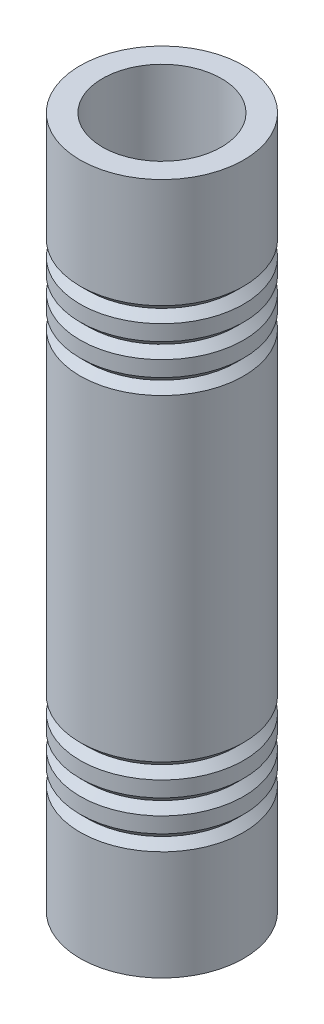
ISO-10303-21;
HEADER;
FILE_DESCRIPTION(('STEP AP214'),'2;1');
FILE_NAME('part.step','',(''),(''),'','','');
FILE_SCHEMA(('AUTOMOTIVE_DESIGN { 1 0 10303 214 1 1 1 1 }'));
ENDSEC;
DATA;
#1=APPLICATION_CONTEXT('core data for automotive mechanical design processes');
#2=APPLICATION_PROTOCOL_DEFINITION('international standard','automotive_design',2000,#1);
#3=PRODUCT_CONTEXT('',#1,'mechanical');
#4=PRODUCT('Part','Part','',(#3));
#5=PRODUCT_RELATED_PRODUCT_CATEGORY('part','',(#4));
#6=PRODUCT_DEFINITION_FORMATION('','',#4);
#7=PRODUCT_DEFINITION_CONTEXT('part definition',#1,'design');
#8=PRODUCT_DEFINITION('design','',#6,#7);
#9=PRODUCT_DEFINITION_SHAPE('','',#8);
#10=(LENGTH_UNIT() NAMED_UNIT(*) SI_UNIT(.MILLI.,.METRE.));
#11=(NAMED_UNIT(*) PLANE_ANGLE_UNIT() SI_UNIT($,.RADIAN.));
#12=(NAMED_UNIT(*) SI_UNIT($,.STERADIAN.) SOLID_ANGLE_UNIT());
#13=UNCERTAINTY_MEASURE_WITH_UNIT(LENGTH_MEASURE(1.E-05),#10,'distance_accuracy_value','');
#14=(GEOMETRIC_REPRESENTATION_CONTEXT(3) GLOBAL_UNCERTAINTY_ASSIGNED_CONTEXT((#13)) GLOBAL_UNIT_ASSIGNED_CONTEXT((#10,
#11,#12)) REPRESENTATION_CONTEXT('',''));
#15=CARTESIAN_POINT('',(0.,0.,0.));
#16=DIRECTION('',(0.,0.,1.));
#17=DIRECTION('',(1.,0.,0.));
#18=AXIS2_PLACEMENT_3D('',#15,#16,#17);
#19=CARTESIAN_POINT('',(0.,0.,0.));
#20=DIRECTION('',(0.,1.,0.));
#21=DIRECTION('',(0.,0.,1.));
#22=AXIS2_PLACEMENT_3D('',#19,#20,#21);
#23=CYLINDRICAL_SURFACE('',#22,15.2908000000005);
#24=CARTESIAN_POINT('',(0.,177.8,0.));
#25=DIRECTION('',(0.,1.,0.));
#26=DIRECTION('',(0.,0.,1.));
#27=AXIS2_PLACEMENT_3D('',#24,#25,#26);
#28=CIRCLE('',#27,15.2908000000011);
#29=CARTESIAN_POINT('',(0.,177.8,15.2908000000011));
#30=VERTEX_POINT('',#29);
#31=EDGE_CURVE('E10',#30,#30,#28,.T.);
#32=ORIENTED_EDGE('',*,*,#31,.T.);
#33=EDGE_LOOP('',(#32));
#34=FACE_BOUND('',#33,.T.);
#35=CARTESIAN_POINT('',(0.,0.,0.));
#36=DIRECTION('',(0.,1.,0.));
#37=DIRECTION('',(0.,0.,1.));
#38=AXIS2_PLACEMENT_3D('',#35,#36,#37);
#39=CIRCLE('',#38,15.2907999999998);
#40=CARTESIAN_POINT('',(0.,0.,15.2907999999998));
#41=VERTEX_POINT('',#40);
#42=EDGE_CURVE('E105',#41,#41,#39,.T.);
#43=ORIENTED_EDGE('',*,*,#42,.F.);
#44=EDGE_LOOP('',(#43));
#45=FACE_BOUND('',#44,.T.);
#46=ADVANCED_FACE('F35',(#34,#45),#23,.F.);
#47=CARTESIAN_POINT('',(15.2908000000011,177.8,0.));
#48=DIRECTION('',(0.,1.,0.));
#49=DIRECTION('',(0.,0.,1.));
#50=AXIS2_PLACEMENT_3D('',#47,#48,#49);
#51=PLANE('',#50);
#52=CARTESIAN_POINT('',(0.,177.8,0.));
#53=DIRECTION('',(0.,1.,0.));
#54=DIRECTION('',(0.,0.,1.));
#55=AXIS2_PLACEMENT_3D('',#52,#53,#54);
#56=CIRCLE('',#55,21.0343750000013);
#57=CARTESIAN_POINT('',(0.,177.8,21.0343750000013));
#58=VERTEX_POINT('',#57);
#59=EDGE_CURVE('E41',#58,#58,#56,.T.);
#60=ORIENTED_EDGE('',*,*,#59,.T.);
#61=EDGE_LOOP('',(#60));
#62=FACE_BOUND('',#61,.T.);
#63=ORIENTED_EDGE('',*,*,#31,.F.);
#64=EDGE_LOOP('',(#63));
#65=FACE_BOUND('',#64,.T.);
#66=ADVANCED_FACE('F113',(#62,#65),#51,.T.);
#67=CARTESIAN_POINT('',(0.,0.,0.));
#68=DIRECTION('',(0.,1.,0.));
#69=DIRECTION('',(0.,0.,1.));
#70=AXIS2_PLACEMENT_3D('',#67,#68,#69);
#71=CYLINDRICAL_SURFACE('',#70,21.0343750000006);
#72=CARTESIAN_POINT('',(0.,149.7,0.));
#73=DIRECTION('',(0.,1.,0.));
#74=DIRECTION('',(0.,0.,1.));
#75=AXIS2_PLACEMENT_3D('',#72,#73,#74);
#76=CIRCLE('',#75,21.034375);
#77=CARTESIAN_POINT('',(0.,149.7,21.034375));
#78=VERTEX_POINT('',#77);
#79=EDGE_CURVE('E45',#78,#78,#76,.T.);
#80=ORIENTED_EDGE('',*,*,#79,.T.);
#81=EDGE_LOOP('',(#80));
#82=FACE_BOUND('',#81,.T.);
#83=ORIENTED_EDGE('',*,*,#59,.F.);
#84=EDGE_LOOP('',(#83));
#85=FACE_BOUND('',#84,.T.);
#86=ADVANCED_FACE('F117',(#82,#85),#71,.T.);
#87=CARTESIAN_POINT('',(0.,149.7,0.));
#88=DIRECTION('',(0.,1.,0.));
#89=DIRECTION('',(0.,0.,1.));
#90=AXIS2_PLACEMENT_3D('',#87,#88,#89);
#91=CONICAL_SURFACE('',#90,21.034375,0.785398163397146);
#92=CARTESIAN_POINT('',(0.,147.7,0.));
#93=DIRECTION('',(0.,1.,0.));
#94=DIRECTION('',(0.,0.,1.));
#95=AXIS2_PLACEMENT_3D('',#92,#93,#94);
#96=CIRCLE('',#95,19.0343750000012);
#97=CARTESIAN_POINT('',(0.,147.7,19.0343750000012));
#98=VERTEX_POINT('',#97);
#99=EDGE_CURVE('E49',#98,#98,#96,.T.);
#100=ORIENTED_EDGE('',*,*,#99,.T.);
#101=EDGE_LOOP('',(#100));
#102=FACE_BOUND('',#101,.T.);
#103=ORIENTED_EDGE('',*,*,#79,.F.);
#104=EDGE_LOOP('',(#103));
#105=FACE_BOUND('',#104,.T.);
#106=ADVANCED_FACE('F121',(#102,#105),#91,.T.);
#107=CARTESIAN_POINT('',(0.,147.7,0.));
#108=DIRECTION('',(0.,-1.,0.));
#109=DIRECTION('',(0.,0.,-1.));
#110=AXIS2_PLACEMENT_3D('',#107,#108,#109);
#111=CONICAL_SURFACE('',#110,19.0343750000012,0.785398163397146);
#112=CARTESIAN_POINT('',(0.,145.7,0.));
#113=DIRECTION('',(0.,1.,0.));
#114=DIRECTION('',(0.,0.,1.));
#115=AXIS2_PLACEMENT_3D('',#112,#113,#114);
#116=CIRCLE('',#115,21.034375);
#117=CARTESIAN_POINT('',(0.,145.7,21.034375));
#118=VERTEX_POINT('',#117);
#119=EDGE_CURVE('E54',#118,#118,#116,.T.);
#120=ORIENTED_EDGE('',*,*,#119,.T.);
#121=EDGE_LOOP('',(#120));
#122=FACE_BOUND('',#121,.T.);
#123=ORIENTED_EDGE('',*,*,#99,.F.);
#124=EDGE_LOOP('',(#123));
#125=FACE_BOUND('',#124,.T.);
#126=ADVANCED_FACE('F128',(#122,#125),#111,.T.);
#127=CARTESIAN_POINT('',(0.,0.,0.));
#128=DIRECTION('',(0.,1.,0.));
#129=DIRECTION('',(0.,0.,1.));
#130=AXIS2_PLACEMENT_3D('',#127,#128,#129);
#131=CYLINDRICAL_SURFACE('',#130,21.034375);
#132=CARTESIAN_POINT('',(0.,141.7,0.));
#133=DIRECTION('',(0.,1.,0.));
#134=DIRECTION('',(0.,0.,1.));
#135=AXIS2_PLACEMENT_3D('',#132,#133,#134);
#136=CIRCLE('',#135,21.034375);
#137=CARTESIAN_POINT('',(0.,141.7,21.034375));
#138=VERTEX_POINT('',#137);
#139=EDGE_CURVE('E57',#138,#138,#136,.T.);
#140=ORIENTED_EDGE('',*,*,#139,.T.);
#141=EDGE_LOOP('',(#140));
#142=FACE_BOUND('',#141,.T.);
#143=ORIENTED_EDGE('',*,*,#119,.F.);
#144=EDGE_LOOP('',(#143));
#145=FACE_BOUND('',#144,.T.);
#146=ADVANCED_FACE('F132',(#142,#145),#131,.T.);
#147=CARTESIAN_POINT('',(0.,141.7,0.));
#148=DIRECTION('',(0.,1.,0.));
#149=DIRECTION('',(0.,0.,1.));
#150=AXIS2_PLACEMENT_3D('',#147,#148,#149);
#151=CONICAL_SURFACE('',#150,21.034375,0.785398163397455);
#152=CARTESIAN_POINT('',(0.,139.7,0.));
#153=DIRECTION('',(0.,1.,0.));
#154=DIRECTION('',(0.,0.,1.));
#155=AXIS2_PLACEMENT_3D('',#152,#153,#154);
#156=CIRCLE('',#155,19.034375);
#157=CARTESIAN_POINT('',(0.,139.7,19.034375));
#158=VERTEX_POINT('',#157);
#159=EDGE_CURVE('E60',#158,#158,#156,.T.);
#160=ORIENTED_EDGE('',*,*,#159,.T.);
#161=EDGE_LOOP('',(#160));
#162=FACE_BOUND('',#161,.T.);
#163=ORIENTED_EDGE('',*,*,#139,.F.);
#164=EDGE_LOOP('',(#163));
#165=FACE_BOUND('',#164,.T.);
#166=ADVANCED_FACE('F136',(#162,#165),#151,.T.);
#167=CARTESIAN_POINT('',(0.,139.7,0.));
#168=DIRECTION('',(0.,-1.,0.));
#169=DIRECTION('',(0.,0.,-1.));
#170=AXIS2_PLACEMENT_3D('',#167,#168,#169);
#171=CONICAL_SURFACE('',#170,19.034375,0.785398163397455);
#172=CARTESIAN_POINT('',(0.,137.7,0.));
#173=DIRECTION('',(0.,1.,0.));
#174=DIRECTION('',(0.,0.,1.));
#175=AXIS2_PLACEMENT_3D('',#172,#173,#174);
#176=CIRCLE('',#175,21.034375);
#177=CARTESIAN_POINT('',(0.,137.7,21.034375));
#178=VERTEX_POINT('',#177);
#179=EDGE_CURVE('E63',#178,#178,#176,.T.);
#180=ORIENTED_EDGE('',*,*,#179,.T.);
#181=EDGE_LOOP('',(#180));
#182=FACE_BOUND('',#181,.T.);
#183=ORIENTED_EDGE('',*,*,#159,.F.);
#184=EDGE_LOOP('',(#183));
#185=FACE_BOUND('',#184,.T.);
#186=ADVANCED_FACE('F140',(#182,#185),#171,.T.);
#187=CARTESIAN_POINT('',(0.,0.,0.));
#188=DIRECTION('',(0.,1.,0.));
#189=DIRECTION('',(0.,0.,1.));
#190=AXIS2_PLACEMENT_3D('',#187,#188,#189);
#191=CYLINDRICAL_SURFACE('',#190,21.034375);
#192=CARTESIAN_POINT('',(0.,133.7,0.));
#193=DIRECTION('',(0.,1.,0.));
#194=DIRECTION('',(0.,0.,1.));
#195=AXIS2_PLACEMENT_3D('',#192,#193,#194);
#196=CIRCLE('',#195,21.034375);
#197=CARTESIAN_POINT('',(0.,133.7,21.034375));
#198=VERTEX_POINT('',#197);
#199=EDGE_CURVE('E66',#198,#198,#196,.T.);
#200=ORIENTED_EDGE('',*,*,#199,.T.);
#201=EDGE_LOOP('',(#200));
#202=FACE_BOUND('',#201,.T.);
#203=ORIENTED_EDGE('',*,*,#179,.F.);
#204=EDGE_LOOP('',(#203));
#205=FACE_BOUND('',#204,.T.);
#206=ADVANCED_FACE('F144',(#202,#205),#191,.T.);
#207=CARTESIAN_POINT('',(0.,133.7,0.));
#208=DIRECTION('',(0.,1.,0.));
#209=DIRECTION('',(0.,0.,1.));
#210=AXIS2_PLACEMENT_3D('',#207,#208,#209);
#211=CONICAL_SURFACE('',#210,21.034375,0.785398163397447);
#212=CARTESIAN_POINT('',(0.,131.7,0.));
#213=DIRECTION('',(0.,1.,0.));
#214=DIRECTION('',(0.,0.,1.));
#215=AXIS2_PLACEMENT_3D('',#212,#213,#214);
#216=CIRCLE('',#215,19.034375);
#217=CARTESIAN_POINT('',(0.,131.7,19.034375));
#218=VERTEX_POINT('',#217);
#219=EDGE_CURVE('E69',#218,#218,#216,.T.);
#220=ORIENTED_EDGE('',*,*,#219,.T.);
#221=EDGE_LOOP('',(#220));
#222=FACE_BOUND('',#221,.T.);
#223=ORIENTED_EDGE('',*,*,#199,.F.);
#224=EDGE_LOOP('',(#223));
#225=FACE_BOUND('',#224,.T.);
#226=ADVANCED_FACE('F148',(#222,#225),#211,.T.);
#227=CARTESIAN_POINT('',(0.,131.7,0.));
#228=DIRECTION('',(0.,-1.,0.));
#229=DIRECTION('',(0.,0.,-1.));
#230=AXIS2_PLACEMENT_3D('',#227,#228,#229);
#231=CONICAL_SURFACE('',#230,19.034375,0.78539816339746);
#232=CARTESIAN_POINT('',(0.,129.7,0.));
#233=DIRECTION('',(0.,1.,0.));
#234=DIRECTION('',(0.,0.,1.));
#235=AXIS2_PLACEMENT_3D('',#232,#233,#234);
#236=CIRCLE('',#235,21.034375);
#237=CARTESIAN_POINT('',(0.,129.7,21.034375));
#238=VERTEX_POINT('',#237);
#239=EDGE_CURVE('E72',#238,#238,#236,.T.);
#240=ORIENTED_EDGE('',*,*,#239,.T.);
#241=EDGE_LOOP('',(#240));
#242=FACE_BOUND('',#241,.T.);
#243=ORIENTED_EDGE('',*,*,#219,.F.);
#244=EDGE_LOOP('',(#243));
#245=FACE_BOUND('',#244,.T.);
#246=ADVANCED_FACE('F152',(#242,#245),#231,.T.);
#247=CARTESIAN_POINT('',(0.,0.,0.));
#248=DIRECTION('',(0.,1.,0.));
#249=DIRECTION('',(0.,0.,1.));
#250=AXIS2_PLACEMENT_3D('',#247,#248,#249);
#251=CYLINDRICAL_SURFACE('',#250,21.034375);
#252=CARTESIAN_POINT('',(0.,48.1,0.));
#253=DIRECTION('',(0.,1.,0.));
#254=DIRECTION('',(0.,0.,1.));
#255=AXIS2_PLACEMENT_3D('',#252,#253,#254);
#256=CIRCLE('',#255,21.034375);
#257=CARTESIAN_POINT('',(0.,48.1,21.034375));
#258=VERTEX_POINT('',#257);
#259=EDGE_CURVE('E75',#258,#258,#256,.T.);
#260=ORIENTED_EDGE('',*,*,#259,.T.);
#261=EDGE_LOOP('',(#260));
#262=FACE_BOUND('',#261,.T.);
#263=ORIENTED_EDGE('',*,*,#239,.F.);
#264=EDGE_LOOP('',(#263));
#265=FACE_BOUND('',#264,.T.);
#266=ADVANCED_FACE('F156',(#262,#265),#251,.T.);
#267=CARTESIAN_POINT('',(0.,48.1,0.));
#268=DIRECTION('',(0.,1.,0.));
#269=DIRECTION('',(0.,0.,1.));
#270=AXIS2_PLACEMENT_3D('',#267,#268,#269);
#271=CONICAL_SURFACE('',#270,21.034375,0.785398163397455);
#272=CARTESIAN_POINT('',(0.,46.1,0.));
#273=DIRECTION('',(0.,1.,0.));
#274=DIRECTION('',(0.,0.,1.));
#275=AXIS2_PLACEMENT_3D('',#272,#273,#274);
#276=CIRCLE('',#275,19.034375);
#277=CARTESIAN_POINT('',(0.,46.1,19.034375));
#278=VERTEX_POINT('',#277);
#279=EDGE_CURVE('E78',#278,#278,#276,.T.);
#280=ORIENTED_EDGE('',*,*,#279,.T.);
#281=EDGE_LOOP('',(#280));
#282=FACE_BOUND('',#281,.T.);
#283=ORIENTED_EDGE('',*,*,#259,.F.);
#284=EDGE_LOOP('',(#283));
#285=FACE_BOUND('',#284,.T.);
#286=ADVANCED_FACE('F160',(#282,#285),#271,.T.);
#287=CARTESIAN_POINT('',(0.,46.1,0.));
#288=DIRECTION('',(0.,-1.,0.));
#289=DIRECTION('',(0.,0.,-1.));
#290=AXIS2_PLACEMENT_3D('',#287,#288,#289);
#291=CONICAL_SURFACE('',#290,19.034375,0.785398163397453);
#292=CARTESIAN_POINT('',(0.,44.1000000000001,0.));
#293=DIRECTION('',(0.,1.,0.));
#294=DIRECTION('',(0.,0.,1.));
#295=AXIS2_PLACEMENT_3D('',#292,#293,#294);
#296=CIRCLE('',#295,21.034375);
#297=CARTESIAN_POINT('',(0.,44.1000000000001,21.034375));
#298=VERTEX_POINT('',#297);
#299=EDGE_CURVE('E81',#298,#298,#296,.T.);
#300=ORIENTED_EDGE('',*,*,#299,.T.);
#301=EDGE_LOOP('',(#300));
#302=FACE_BOUND('',#301,.T.);
#303=ORIENTED_EDGE('',*,*,#279,.F.);
#304=EDGE_LOOP('',(#303));
#305=FACE_BOUND('',#304,.T.);
#306=ADVANCED_FACE('F164',(#302,#305),#291,.T.);
#307=CARTESIAN_POINT('',(0.,0.,0.));
#308=DIRECTION('',(0.,1.,0.));
#309=DIRECTION('',(0.,0.,1.));
#310=AXIS2_PLACEMENT_3D('',#307,#308,#309);
#311=CYLINDRICAL_SURFACE('',#310,21.034375);
#312=CARTESIAN_POINT('',(0.,40.1,0.));
#313=DIRECTION('',(0.,1.,0.));
#314=DIRECTION('',(0.,0.,1.));
#315=AXIS2_PLACEMENT_3D('',#312,#313,#314);
#316=CIRCLE('',#315,21.034375);
#317=CARTESIAN_POINT('',(0.,40.1,21.034375));
#318=VERTEX_POINT('',#317);
#319=EDGE_CURVE('E84',#318,#318,#316,.T.);
#320=ORIENTED_EDGE('',*,*,#319,.T.);
#321=EDGE_LOOP('',(#320));
#322=FACE_BOUND('',#321,.T.);
#323=ORIENTED_EDGE('',*,*,#299,.F.);
#324=EDGE_LOOP('',(#323));
#325=FACE_BOUND('',#324,.T.);
#326=ADVANCED_FACE('F168',(#322,#325),#311,.T.);
#327=CARTESIAN_POINT('',(0.,40.1,0.));
#328=DIRECTION('',(0.,1.,0.));
#329=DIRECTION('',(0.,0.,1.));
#330=AXIS2_PLACEMENT_3D('',#327,#328,#329);
#331=CONICAL_SURFACE('',#330,21.034375,0.785398163397455);
#332=CARTESIAN_POINT('',(0.,38.1,0.));
#333=DIRECTION('',(0.,1.,0.));
#334=DIRECTION('',(0.,0.,1.));
#335=AXIS2_PLACEMENT_3D('',#332,#333,#334);
#336=CIRCLE('',#335,19.034375);
#337=CARTESIAN_POINT('',(0.,38.1,19.034375));
#338=VERTEX_POINT('',#337);
#339=EDGE_CURVE('E87',#338,#338,#336,.T.);
#340=ORIENTED_EDGE('',*,*,#339,.T.);
#341=EDGE_LOOP('',(#340));
#342=FACE_BOUND('',#341,.T.);
#343=ORIENTED_EDGE('',*,*,#319,.F.);
#344=EDGE_LOOP('',(#343));
#345=FACE_BOUND('',#344,.T.);
#346=ADVANCED_FACE('F172',(#342,#345),#331,.T.);
#347=CARTESIAN_POINT('',(0.,38.1,0.));
#348=DIRECTION('',(0.,-1.,0.));
#349=DIRECTION('',(0.,0.,-1.));
#350=AXIS2_PLACEMENT_3D('',#347,#348,#349);
#351=CONICAL_SURFACE('',#350,19.034375,0.785398163397455);
#352=CARTESIAN_POINT('',(0.,36.1000000000001,0.));
#353=DIRECTION('',(0.,1.,0.));
#354=DIRECTION('',(0.,0.,1.));
#355=AXIS2_PLACEMENT_3D('',#352,#353,#354);
#356=CIRCLE('',#355,21.034375);
#357=CARTESIAN_POINT('',(0.,36.1000000000001,21.034375));
#358=VERTEX_POINT('',#357);
#359=EDGE_CURVE('E90',#358,#358,#356,.T.);
#360=ORIENTED_EDGE('',*,*,#359,.T.);
#361=EDGE_LOOP('',(#360));
#362=FACE_BOUND('',#361,.T.);
#363=ORIENTED_EDGE('',*,*,#339,.F.);
#364=EDGE_LOOP('',(#363));
#365=FACE_BOUND('',#364,.T.);
#366=ADVANCED_FACE('F176',(#362,#365),#351,.T.);
#367=CARTESIAN_POINT('',(0.,0.,0.));
#368=DIRECTION('',(0.,1.,0.));
#369=DIRECTION('',(0.,0.,1.));
#370=AXIS2_PLACEMENT_3D('',#367,#368,#369);
#371=CYLINDRICAL_SURFACE('',#370,21.034375);
#372=CARTESIAN_POINT('',(0.,32.1,0.));
#373=DIRECTION('',(0.,1.,0.));
#374=DIRECTION('',(0.,0.,1.));
#375=AXIS2_PLACEMENT_3D('',#372,#373,#374);
#376=CIRCLE('',#375,21.034375);
#377=CARTESIAN_POINT('',(0.,32.1,21.034375));
#378=VERTEX_POINT('',#377);
#379=EDGE_CURVE('E93',#378,#378,#376,.T.);
#380=ORIENTED_EDGE('',*,*,#379,.T.);
#381=EDGE_LOOP('',(#380));
#382=FACE_BOUND('',#381,.T.);
#383=ORIENTED_EDGE('',*,*,#359,.F.);
#384=EDGE_LOOP('',(#383));
#385=FACE_BOUND('',#384,.T.);
#386=ADVANCED_FACE('F180',(#382,#385),#371,.T.);
#387=CARTESIAN_POINT('',(0.,32.1,0.));
#388=DIRECTION('',(0.,1.,0.));
#389=DIRECTION('',(0.,0.,1.));
#390=AXIS2_PLACEMENT_3D('',#387,#388,#389);
#391=CONICAL_SURFACE('',#390,21.034375,0.785398163397455);
#392=CARTESIAN_POINT('',(0.,30.1,0.));
#393=DIRECTION('',(0.,1.,0.));
#394=DIRECTION('',(0.,0.,1.));
#395=AXIS2_PLACEMENT_3D('',#392,#393,#394);
#396=CIRCLE('',#395,19.034375);
#397=CARTESIAN_POINT('',(0.,30.1,19.034375));
#398=VERTEX_POINT('',#397);
#399=EDGE_CURVE('E96',#398,#398,#396,.T.);
#400=ORIENTED_EDGE('',*,*,#399,.T.);
#401=EDGE_LOOP('',(#400));
#402=FACE_BOUND('',#401,.T.);
#403=ORIENTED_EDGE('',*,*,#379,.F.);
#404=EDGE_LOOP('',(#403));
#405=FACE_BOUND('',#404,.T.);
#406=ADVANCED_FACE('F184',(#402,#405),#391,.T.);
#407=CARTESIAN_POINT('',(0.,30.1,0.));
#408=DIRECTION('',(0.,-1.,0.));
#409=DIRECTION('',(0.,0.,-1.));
#410=AXIS2_PLACEMENT_3D('',#407,#408,#409);
#411=CONICAL_SURFACE('',#410,19.034375,0.785398163397453);
#412=CARTESIAN_POINT('',(0.,28.1,0.));
#413=DIRECTION('',(0.,1.,0.));
#414=DIRECTION('',(0.,0.,1.));
#415=AXIS2_PLACEMENT_3D('',#412,#413,#414);
#416=CIRCLE('',#415,21.034375);
#417=CARTESIAN_POINT('',(0.,28.1,21.034375));
#418=VERTEX_POINT('',#417);
#419=EDGE_CURVE('E99',#418,#418,#416,.T.);
#420=ORIENTED_EDGE('',*,*,#419,.T.);
#421=EDGE_LOOP('',(#420));
#422=FACE_BOUND('',#421,.T.);
#423=ORIENTED_EDGE('',*,*,#399,.F.);
#424=EDGE_LOOP('',(#423));
#425=FACE_BOUND('',#424,.T.);
#426=ADVANCED_FACE('F188',(#422,#425),#411,.T.);
#427=CARTESIAN_POINT('',(0.,0.,0.));
#428=DIRECTION('',(0.,1.,0.));
#429=DIRECTION('',(0.,0.,1.));
#430=AXIS2_PLACEMENT_3D('',#427,#428,#429);
#431=CYLINDRICAL_SURFACE('',#430,21.0343750000006);
#432=CARTESIAN_POINT('',(0.,0.,0.));
#433=DIRECTION('',(0.,1.,0.));
#434=DIRECTION('',(0.,0.,1.));
#435=AXIS2_PLACEMENT_3D('',#432,#433,#434);
#436=CIRCLE('',#435,21.0343750000013);
#437=CARTESIAN_POINT('',(0.,0.,21.0343750000013));
#438=VERTEX_POINT('',#437);
#439=EDGE_CURVE('E102',#438,#438,#436,.T.);
#440=ORIENTED_EDGE('',*,*,#439,.T.);
#441=EDGE_LOOP('',(#440));
#442=FACE_BOUND('',#441,.T.);
#443=ORIENTED_EDGE('',*,*,#419,.F.);
#444=EDGE_LOOP('',(#443));
#445=FACE_BOUND('',#444,.T.);
#446=ADVANCED_FACE('F192',(#442,#445),#431,.T.);
#447=CARTESIAN_POINT('',(21.0343750000013,0.,0.));
#448=DIRECTION('',(0.,-1.,0.));
#449=DIRECTION('',(0.,0.,-1.));
#450=AXIS2_PLACEMENT_3D('',#447,#448,#449);
#451=PLANE('',#450);
#452=ORIENTED_EDGE('',*,*,#42,.T.);
#453=EDGE_LOOP('',(#452));
#454=FACE_BOUND('',#453,.T.);
#455=ORIENTED_EDGE('',*,*,#439,.F.);
#456=EDGE_LOOP('',(#455));
#457=FACE_BOUND('',#456,.T.);
#458=ADVANCED_FACE('F109',(#454,#457),#451,.T.);
#459=CLOSED_SHELL('',(#46,#66,#86,#106,#126,#146,#166,#186,#206,#226,#246,#266,#286,#306,#326,
#346,#366,#386,#406,#426,#446,#458));
#460=MANIFOLD_SOLID_BREP('B2',#459);
#461=ADVANCED_BREP_SHAPE_REPRESENTATION('',(#18,#460),#14);
#462=SHAPE_DEFINITION_REPRESENTATION(#9,#461);
ENDSEC;
END-ISO-10303-21;
